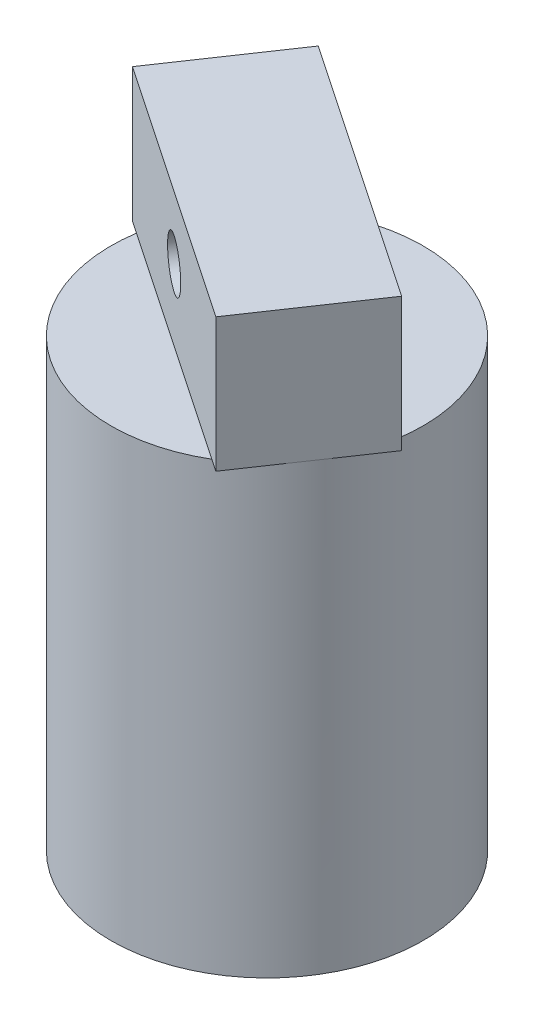
ISO-10303-21;
HEADER;
FILE_DESCRIPTION(('STEP AP214'),'2;1');
FILE_NAME('part.step','',(''),(''),'','','');
FILE_SCHEMA(('AUTOMOTIVE_DESIGN { 1 0 10303 214 1 1 1 1 }'));
ENDSEC;
DATA;
#1=APPLICATION_CONTEXT('core data for automotive mechanical design processes');
#2=APPLICATION_PROTOCOL_DEFINITION('international standard','automotive_design',2000,#1);
#3=PRODUCT_CONTEXT('',#1,'mechanical');
#4=PRODUCT('Part','Part','',(#3));
#5=PRODUCT_RELATED_PRODUCT_CATEGORY('part','',(#4));
#6=PRODUCT_DEFINITION_FORMATION('','',#4);
#7=PRODUCT_DEFINITION_CONTEXT('part definition',#1,'design');
#8=PRODUCT_DEFINITION('design','',#6,#7);
#9=PRODUCT_DEFINITION_SHAPE('','',#8);
#10=(LENGTH_UNIT() NAMED_UNIT(*) SI_UNIT(.MILLI.,.METRE.));
#11=(NAMED_UNIT(*) PLANE_ANGLE_UNIT() SI_UNIT($,.RADIAN.));
#12=(NAMED_UNIT(*) SI_UNIT($,.STERADIAN.) SOLID_ANGLE_UNIT());
#13=UNCERTAINTY_MEASURE_WITH_UNIT(LENGTH_MEASURE(1.E-05),#10,'distance_accuracy_value','');
#14=(GEOMETRIC_REPRESENTATION_CONTEXT(3) GLOBAL_UNCERTAINTY_ASSIGNED_CONTEXT((#13)) GLOBAL_UNIT_ASSIGNED_CONTEXT((#10,
#11,#12)) REPRESENTATION_CONTEXT('',''));
#15=CARTESIAN_POINT('',(0.,0.,0.));
#16=DIRECTION('',(0.,0.,1.));
#17=DIRECTION('',(1.,0.,0.));
#18=AXIS2_PLACEMENT_3D('',#15,#16,#17);
#19=CARTESIAN_POINT('',(0.,10.,0.));
#20=DIRECTION('',(0.,1.,0.));
#21=DIRECTION('',(0.,0.,1.));
#22=AXIS2_PLACEMENT_3D('',#19,#20,#21);
#23=PLANE('',#22);
#24=CARTESIAN_POINT('',(0.,10.,0.));
#25=DIRECTION('',(0.,1.,0.));
#26=DIRECTION('',(0.,0.,1.));
#27=AXIS2_PLACEMENT_3D('',#24,#25,#26);
#28=CIRCLE('',#27,3.5);
#29=CARTESIAN_POINT('',(3.45943096664212,10.,0.531354295209469));
#30=VERTEX_POINT('',#29);
#31=CARTESIAN_POINT('',(-1.77712004402859,10.,-3.01526853681589));
#32=VERTEX_POINT('',#31);
#33=EDGE_CURVE('E156',#30,#32,#28,.T.);
#34=ORIENTED_EDGE('',*,*,#33,.T.);
#35=DIRECTION('',(0.827971413868807,0.,0.560770307537845));
#36=VECTOR('',#35,1.);
#37=CARTESIAN_POINT('',(3.73905540984759,10.,0.720738955579247));
#38=LINE('',#37,#36);
#39=EDGE_CURVE('E42',#32,#30,#38,.T.);
#40=ORIENTED_EDGE('',*,*,#39,.T.);
#41=EDGE_LOOP('',(#34,#40));
#42=FACE_BOUND('',#41,.T.);
#43=ADVANCED_FACE('F33',(#42),#23,.T.);
#44=CARTESIAN_POINT('',(0.,10.,0.));
#45=DIRECTION('',(0.,-1.,0.));
#46=DIRECTION('',(0.,0.,-1.));
#47=AXIS2_PLACEMENT_3D('',#44,#45,#46);
#48=CYLINDRICAL_SURFACE('',#47,3.5);
#49=CARTESIAN_POINT('',(1.77712004402859,10.,3.01526853681589));
#50=VERTEX_POINT('',#49);
#51=CARTESIAN_POINT('',(2.89789994854082,10.,1.96269607638246));
#52=VERTEX_POINT('',#51);
#53=EDGE_CURVE('E151',#50,#52,#28,.T.);
#54=ORIENTED_EDGE('',*,*,#53,.F.);
#55=CARTESIAN_POINT('',(-3.45943096664212,10.,-0.53135429520947));
#56=VERTEX_POINT('',#55);
#57=EDGE_CURVE('E153',#56,#50,#28,.T.);
#58=ORIENTED_EDGE('',*,*,#57,.F.);
#59=CARTESIAN_POINT('',(-2.89789994854082,10.,-1.96269607638246));
#60=VERTEX_POINT('',#59);
#61=EDGE_CURVE('E158',#60,#56,#28,.T.);
#62=ORIENTED_EDGE('',*,*,#61,.F.);
#63=EDGE_CURVE('E162',#32,#60,#28,.T.);
#64=ORIENTED_EDGE('',*,*,#63,.F.);
#65=ORIENTED_EDGE('',*,*,#33,.F.);
#66=EDGE_CURVE('E152',#52,#30,#28,.T.);
#67=ORIENTED_EDGE('',*,*,#66,.F.);
#68=EDGE_LOOP('',(#54,#58,#62,#64,#65,#67));
#69=FACE_BOUND('',#68,.T.);
#70=CARTESIAN_POINT('',(0.,0.,0.));
#71=DIRECTION('',(0.,1.,0.));
#72=DIRECTION('',(0.,0.,1.));
#73=AXIS2_PLACEMENT_3D('',#70,#71,#72);
#74=CIRCLE('',#73,3.5);
#75=CARTESIAN_POINT('',(0.,0.,3.5));
#76=VERTEX_POINT('',#75);
#77=EDGE_CURVE('E37',#76,#76,#74,.T.);
#78=ORIENTED_EDGE('',*,*,#77,.T.);
#79=EDGE_LOOP('',(#78));
#80=FACE_BOUND('',#79,.T.);
#81=ADVANCED_FACE('F35',(#69,#80),#48,.T.);
#82=DIRECTION('',(0.827971413868807,0.,0.560770307537845));
#83=VECTOR('',#82,1.);
#84=CARTESIAN_POINT('',(2.05674448723406,10.,3.20465319718567));
#85=LINE('',#84,#83);
#86=EDGE_CURVE('E11',#56,#50,#85,.T.);
#87=ORIENTED_EDGE('',*,*,#86,.F.);
#88=ORIENTED_EDGE('',*,*,#57,.T.);
#89=EDGE_LOOP('',(#87,#88));
#90=FACE_BOUND('',#89,.T.);
#91=ADVANCED_FACE('F170',(#90),#23,.T.);
#92=CARTESIAN_POINT('',(0.,0.,0.));
#93=DIRECTION('',(0.,1.,0.));
#94=DIRECTION('',(0.,0.,1.));
#95=AXIS2_PLACEMENT_3D('',#92,#93,#94);
#96=PLANE('',#95);
#97=CARTESIAN_POINT('',(0.,0.,0.));
#98=DIRECTION('',(0.,-1.,0.));
#99=DIRECTION('',(0.,0.,-1.));
#100=AXIS2_PLACEMENT_3D('',#97,#98,#99);
#101=CIRCLE('',#100,1.6);
#102=CARTESIAN_POINT('',(0.,0.,-1.6));
#103=VERTEX_POINT('',#102);
#104=EDGE_CURVE('E140',#103,#103,#101,.T.);
#105=ORIENTED_EDGE('',*,*,#104,.F.);
#106=EDGE_LOOP('',(#105));
#107=FACE_BOUND('',#106,.T.);
#108=ORIENTED_EDGE('',*,*,#77,.F.);
#109=EDGE_LOOP('',(#108));
#110=FACE_BOUND('',#109,.T.);
#111=ADVANCED_FACE('F167',(#107,#110),#96,.F.);
#112=CARTESIAN_POINT('',(0.,7.,0.));
#113=DIRECTION('',(0.,-1.,0.));
#114=DIRECTION('',(0.,0.,-1.));
#115=AXIS2_PLACEMENT_3D('',#112,#113,#114);
#116=CYLINDRICAL_SURFACE('',#115,1.6);
#117=CARTESIAN_POINT('',(0.,7.,0.));
#118=DIRECTION('',(0.,-1.,0.));
#119=DIRECTION('',(0.,0.,-1.));
#120=AXIS2_PLACEMENT_3D('',#117,#118,#119);
#121=CIRCLE('',#120,1.6);
#122=CARTESIAN_POINT('',(0.,7.,-1.6));
#123=VERTEX_POINT('',#122);
#124=EDGE_CURVE('E147',#123,#123,#121,.T.);
#125=ORIENTED_EDGE('',*,*,#124,.F.);
#126=EDGE_LOOP('',(#125));
#127=FACE_BOUND('',#126,.T.);
#128=ORIENTED_EDGE('',*,*,#104,.T.);
#129=EDGE_LOOP('',(#128));
#130=FACE_BOUND('',#129,.T.);
#131=ADVANCED_FACE('F169',(#127,#130),#116,.F.);
#132=CARTESIAN_POINT('',(0.,7.,0.));
#133=DIRECTION('',(0.,-1.,0.));
#134=DIRECTION('',(0.,0.,-1.));
#135=AXIS2_PLACEMENT_3D('',#132,#133,#134);
#136=PLANE('',#135);
#137=ORIENTED_EDGE('',*,*,#124,.T.);
#138=EDGE_LOOP('',(#137));
#139=FACE_BOUND('',#138,.T.);
#140=ADVANCED_FACE('F176',(#139),#136,.T.);
#141=CARTESIAN_POINT('',(3.73905540984759,10.,0.720738955579247));
#142=DIRECTION('',(0.,-1.,0.));
#143=DIRECTION('',(0.,0.,-1.));
#144=AXIS2_PLACEMENT_3D('',#141,#142,#143);
#145=PLANE('',#144);
#146=CARTESIAN_POINT('',(2.05674448723406,10.,3.20465319718567));
#147=VERTEX_POINT('',#146);
#148=EDGE_CURVE('E45',#50,#147,#85,.T.);
#149=ORIENTED_EDGE('',*,*,#148,.F.);
#150=ORIENTED_EDGE('',*,*,#53,.T.);
#151=DIRECTION('',(-0.560770307537845,0.,0.827971413868806));
#152=VECTOR('',#151,1.);
#153=CARTESIAN_POINT('',(3.73905540984759,10.,0.720738955579247));
#154=LINE('',#153,#152);
#155=EDGE_CURVE('E141',#52,#147,#154,.T.);
#156=ORIENTED_EDGE('',*,*,#155,.T.);
#157=EDGE_LOOP('',(#149,#150,#156));
#158=FACE_BOUND('',#157,.T.);
#159=ADVANCED_FACE('F191',(#158),#145,.T.);
#160=CARTESIAN_POINT('',(3.73905540984759,10.,0.720738955579247));
#161=VERTEX_POINT('',#160);
#162=EDGE_CURVE('E137',#161,#52,#154,.T.);
#163=ORIENTED_EDGE('',*,*,#162,.T.);
#164=ORIENTED_EDGE('',*,*,#66,.T.);
#165=EDGE_CURVE('E52',#30,#161,#38,.T.);
#166=ORIENTED_EDGE('',*,*,#165,.T.);
#167=EDGE_LOOP('',(#163,#164,#166));
#168=FACE_BOUND('',#167,.T.);
#169=ADVANCED_FACE('F247',(#168),#145,.T.);
#170=CARTESIAN_POINT('',(-2.05674448723406,10.,-3.20465319718567));
#171=VERTEX_POINT('',#170);
#172=EDGE_CURVE('E107',#171,#32,#38,.T.);
#173=ORIENTED_EDGE('',*,*,#172,.T.);
#174=ORIENTED_EDGE('',*,*,#63,.T.);
#175=DIRECTION('',(-0.560770307537845,0.,0.827971413868806));
#176=VECTOR('',#175,1.);
#177=CARTESIAN_POINT('',(-2.05674448723406,10.,-3.20465319718567));
#178=LINE('',#177,#176);
#179=EDGE_CURVE('E142',#171,#60,#178,.T.);
#180=ORIENTED_EDGE('',*,*,#179,.F.);
#181=EDGE_LOOP('',(#173,#174,#180));
#182=FACE_BOUND('',#181,.T.);
#183=ADVANCED_FACE('F196',(#182),#145,.T.);
#184=CARTESIAN_POINT('',(3.73905540984759,10.,0.720738955579247));
#185=DIRECTION('',(0.827971413868806,0.,0.560770307537845));
#186=DIRECTION('',(0.560770307537845,0.,-0.827971413868807));
#187=AXIS2_PLACEMENT_3D('',#184,#185,#186);
#188=PLANE('',#187);
#189=DIRECTION('',(-0.560770307537845,0.,0.827971413868806));
#190=VECTOR('',#189,1.);
#191=CARTESIAN_POINT('',(3.73905540984759,13.,0.720738955579247));
#192=LINE('',#191,#190);
#193=CARTESIAN_POINT('',(3.73905540984759,13.,0.720738955579247));
#194=VERTEX_POINT('',#193);
#195=CARTESIAN_POINT('',(2.05674448723406,13.,3.20465319718567));
#196=VERTEX_POINT('',#195);
#197=EDGE_CURVE('E95',#194,#196,#192,.T.);
#198=ORIENTED_EDGE('',*,*,#197,.T.);
#199=DIRECTION('',(0.,1.,0.));
#200=VECTOR('',#199,1.);
#201=CARTESIAN_POINT('',(2.05674448723406,10.,3.20465319718567));
#202=LINE('',#201,#200);
#203=EDGE_CURVE('E100',#147,#196,#202,.T.);
#204=ORIENTED_EDGE('',*,*,#203,.F.);
#205=ORIENTED_EDGE('',*,*,#155,.F.);
#206=ORIENTED_EDGE('',*,*,#162,.F.);
#207=DIRECTION('',(0.,1.,0.));
#208=VECTOR('',#207,1.);
#209=CARTESIAN_POINT('',(3.73905540984759,10.,0.720738955579247));
#210=LINE('',#209,#208);
#211=EDGE_CURVE('E102',#161,#194,#210,.T.);
#212=ORIENTED_EDGE('',*,*,#211,.T.);
#213=EDGE_LOOP('',(#198,#204,#205,#206,#212));
#214=FACE_BOUND('',#213,.T.);
#215=ADVANCED_FACE('F97',(#214),#188,.T.);
#216=CARTESIAN_POINT('',(-3.73905540984759,10.,-0.720738955579248));
#217=VERTEX_POINT('',#216);
#218=EDGE_CURVE('E145',#60,#217,#178,.T.);
#219=ORIENTED_EDGE('',*,*,#218,.F.);
#220=ORIENTED_EDGE('',*,*,#61,.T.);
#221=EDGE_CURVE('E44',#217,#56,#85,.T.);
#222=ORIENTED_EDGE('',*,*,#221,.F.);
#223=EDGE_LOOP('',(#219,#220,#222));
#224=FACE_BOUND('',#223,.T.);
#225=ADVANCED_FACE('F195',(#224),#145,.T.);
#226=CARTESIAN_POINT('',(-2.05674448723406,10.,-3.20465319718567));
#227=DIRECTION('',(-0.827971413868806,0.,-0.560770307537845));
#228=DIRECTION('',(-0.560770307537845,0.,0.827971413868807));
#229=AXIS2_PLACEMENT_3D('',#226,#227,#228);
#230=PLANE('',#229);
#231=ORIENTED_EDGE('',*,*,#179,.T.);
#232=ORIENTED_EDGE('',*,*,#218,.T.);
#233=DIRECTION('',(0.,-1.,0.));
#234=VECTOR('',#233,1.);
#235=CARTESIAN_POINT('',(-3.73905540984759,10.,-0.720738955579248));
#236=LINE('',#235,#234);
#237=CARTESIAN_POINT('',(-3.73905540984759,13.,-0.720738955579248));
#238=VERTEX_POINT('',#237);
#239=EDGE_CURVE('E115',#238,#217,#236,.T.);
#240=ORIENTED_EDGE('',*,*,#239,.F.);
#241=DIRECTION('',(-0.560770307537845,0.,0.827971413868806));
#242=VECTOR('',#241,1.);
#243=CARTESIAN_POINT('',(-2.05674448723406,13.,-3.20465319718567));
#244=LINE('',#243,#242);
#245=CARTESIAN_POINT('',(-2.05674448723406,13.,-3.20465319718567));
#246=VERTEX_POINT('',#245);
#247=EDGE_CURVE('E106',#246,#238,#244,.T.);
#248=ORIENTED_EDGE('',*,*,#247,.F.);
#249=DIRECTION('',(0.,-1.,0.));
#250=VECTOR('',#249,1.);
#251=CARTESIAN_POINT('',(-2.05674448723406,10.,-3.20465319718567));
#252=LINE('',#251,#250);
#253=EDGE_CURVE('E133',#246,#171,#252,.T.);
#254=ORIENTED_EDGE('',*,*,#253,.T.);
#255=EDGE_LOOP('',(#231,#232,#240,#248,#254));
#256=FACE_BOUND('',#255,.T.);
#257=ADVANCED_FACE('F200',(#256),#230,.T.);
#258=CARTESIAN_POINT('',(3.73905540984759,13.,0.720738955579247));
#259=DIRECTION('',(0.,1.,0.));
#260=DIRECTION('',(0.,0.,1.));
#261=AXIS2_PLACEMENT_3D('',#258,#259,#260);
#262=PLANE('',#261);
#263=ORIENTED_EDGE('',*,*,#247,.T.);
#264=DIRECTION('',(-0.827971413868807,0.,-0.560770307537845));
#265=VECTOR('',#264,1.);
#266=CARTESIAN_POINT('',(2.05674448723406,13.,3.20465319718567));
#267=LINE('',#266,#265);
#268=EDGE_CURVE('E110',#196,#238,#267,.T.);
#269=ORIENTED_EDGE('',*,*,#268,.F.);
#270=ORIENTED_EDGE('',*,*,#197,.F.);
#271=DIRECTION('',(-0.827971413868807,0.,-0.560770307537845));
#272=VECTOR('',#271,1.);
#273=CARTESIAN_POINT('',(3.73905540984759,13.,0.720738955579247));
#274=LINE('',#273,#272);
#275=EDGE_CURVE('E131',#194,#246,#274,.T.);
#276=ORIENTED_EDGE('',*,*,#275,.T.);
#277=EDGE_LOOP('',(#263,#269,#270,#276));
#278=FACE_BOUND('',#277,.T.);
#279=ADVANCED_FACE('F111',(#278),#262,.T.);
#280=CARTESIAN_POINT('',(0.841155461306768,0.,-1.24195712080321));
#281=DIRECTION('',(-0.560770307537845,0.,0.827971413868807));
#282=DIRECTION('',(0.827971413868807,0.,0.560770307537845));
#283=AXIS2_PLACEMENT_3D('',#280,#281,#282);
#284=PLANE('',#283);
#285=CARTESIAN_POINT('',(0.841155461306767,11.5976816410637,-1.24195712080321));
#286=DIRECTION('',(-0.560770307537845,0.,0.827971413868807));
#287=DIRECTION('',(0.827971413868807,0.,0.560770307537845));
#288=AXIS2_PLACEMENT_3D('',#285,#286,#287);
#289=CIRCLE('',#288,0.548279790492204);
#290=CARTESIAN_POINT('',(1.29511545463629,11.5976816410637,-0.934498094072112));
#291=VERTEX_POINT('',#290);
#292=EDGE_CURVE('E127',#291,#291,#289,.T.);
#293=ORIENTED_EDGE('',*,*,#292,.T.);
#294=EDGE_LOOP('',(#293));
#295=FACE_BOUND('',#294,.T.);
#296=ORIENTED_EDGE('',*,*,#211,.F.);
#297=ORIENTED_EDGE('',*,*,#165,.F.);
#298=ORIENTED_EDGE('',*,*,#39,.F.);
#299=ORIENTED_EDGE('',*,*,#172,.F.);
#300=ORIENTED_EDGE('',*,*,#253,.F.);
#301=ORIENTED_EDGE('',*,*,#275,.F.);
#302=EDGE_LOOP('',(#296,#297,#298,#299,#300,#301));
#303=FACE_BOUND('',#302,.T.);
#304=ADVANCED_FACE('F199',(#295,#303),#284,.F.);
#305=CARTESIAN_POINT('',(0.841155461306767,11.5976816410637,-1.24195712080321));
#306=DIRECTION('',(-0.560770307537845,0.,0.827971413868806));
#307=DIRECTION('',(0.827971413868807,0.,0.560770307537845));
#308=AXIS2_PLACEMENT_3D('',#305,#306,#307);
#309=CYLINDRICAL_SURFACE('',#308,0.548279790492204);
#310=ORIENTED_EDGE('',*,*,#292,.F.);
#311=EDGE_LOOP('',(#310));
#312=FACE_BOUND('',#311,.T.);
#313=CARTESIAN_POINT('',(-0.841155461306768,11.5976816410637,1.24195712080321));
#314=DIRECTION('',(-0.560770307537845,0.,0.827971413868807));
#315=DIRECTION('',(0.827971413868807,0.,0.560770307537845));
#316=AXIS2_PLACEMENT_3D('',#313,#314,#315);
#317=CIRCLE('',#316,0.548279790492204);
#318=CARTESIAN_POINT('',(-0.387195467977245,11.5976816410637,1.54941614753431));
#319=VERTEX_POINT('',#318);
#320=EDGE_CURVE('E120',#319,#319,#317,.T.);
#321=ORIENTED_EDGE('',*,*,#320,.T.);
#322=EDGE_LOOP('',(#321));
#323=FACE_BOUND('',#322,.T.);
#324=ADVANCED_FACE('F209',(#312,#323),#309,.F.);
#325=CARTESIAN_POINT('',(-0.841155461306768,0.,1.24195712080321));
#326=DIRECTION('',(-0.560770307537845,0.,0.827971413868807));
#327=DIRECTION('',(0.827971413868807,0.,0.560770307537845));
#328=AXIS2_PLACEMENT_3D('',#325,#326,#327);
#329=PLANE('',#328);
#330=ORIENTED_EDGE('',*,*,#203,.T.);
#331=ORIENTED_EDGE('',*,*,#268,.T.);
#332=ORIENTED_EDGE('',*,*,#239,.T.);
#333=ORIENTED_EDGE('',*,*,#221,.T.);
#334=ORIENTED_EDGE('',*,*,#86,.T.);
#335=ORIENTED_EDGE('',*,*,#148,.T.);
#336=EDGE_LOOP('',(#330,#331,#332,#333,#334,#335));
#337=FACE_BOUND('',#336,.T.);
#338=ORIENTED_EDGE('',*,*,#320,.F.);
#339=EDGE_LOOP('',(#338));
#340=FACE_BOUND('',#339,.T.);
#341=ADVANCED_FACE('F117',(#337,#340),#329,.T.);
#342=CLOSED_SHELL('',(#43,#81,#91,#111,#131,#140,#159,#169,#183,#215,#225,#257,#279,#304,#324,#341));
#343=MANIFOLD_SOLID_BREP('B2',#342);
#344=ADVANCED_BREP_SHAPE_REPRESENTATION('',(#18,#343),#14);
#345=SHAPE_DEFINITION_REPRESENTATION(#9,#344);
ENDSEC;
END-ISO-10303-21;
